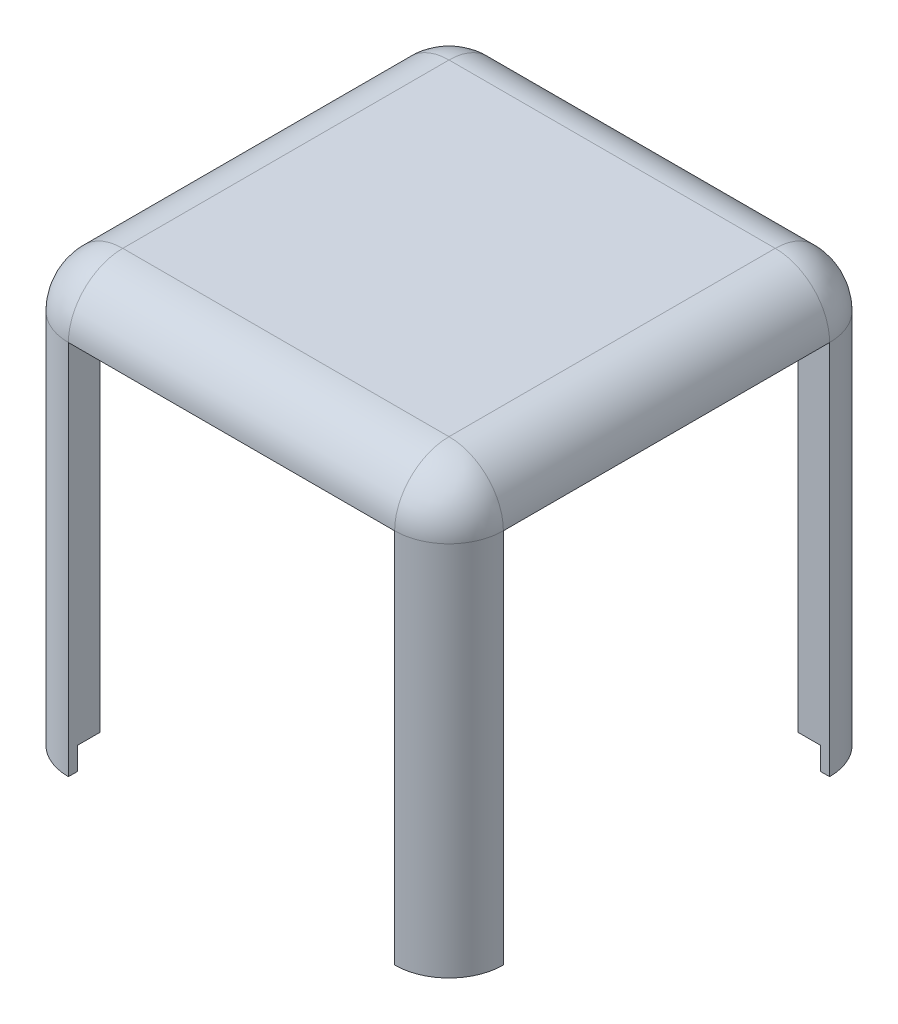
ISO-10303-21;
HEADER;
FILE_DESCRIPTION(('STEP AP214'),'2;1');
FILE_NAME('part.step','',(''),(''),'','','');
FILE_SCHEMA(('AUTOMOTIVE_DESIGN { 1 0 10303 214 1 1 1 1 }'));
ENDSEC;
DATA;
#1=APPLICATION_CONTEXT('core data for automotive mechanical design processes');
#2=APPLICATION_PROTOCOL_DEFINITION('international standard','automotive_design',2000,#1);
#3=PRODUCT_CONTEXT('',#1,'mechanical');
#4=PRODUCT('Part','Part','',(#3));
#5=PRODUCT_RELATED_PRODUCT_CATEGORY('part','',(#4));
#6=PRODUCT_DEFINITION_FORMATION('','',#4);
#7=PRODUCT_DEFINITION_CONTEXT('part definition',#1,'design');
#8=PRODUCT_DEFINITION('design','',#6,#7);
#9=PRODUCT_DEFINITION_SHAPE('','',#8);
#10=(LENGTH_UNIT() NAMED_UNIT(*) SI_UNIT(.MILLI.,.METRE.));
#11=(NAMED_UNIT(*) PLANE_ANGLE_UNIT() SI_UNIT($,.RADIAN.));
#12=(NAMED_UNIT(*) SI_UNIT($,.STERADIAN.) SOLID_ANGLE_UNIT());
#13=UNCERTAINTY_MEASURE_WITH_UNIT(LENGTH_MEASURE(1.E-05),#10,'distance_accuracy_value','');
#14=(GEOMETRIC_REPRESENTATION_CONTEXT(3) GLOBAL_UNCERTAINTY_ASSIGNED_CONTEXT((#13)) GLOBAL_UNIT_ASSIGNED_CONTEXT((#10,
#11,#12)) REPRESENTATION_CONTEXT('',''));
#15=CARTESIAN_POINT('',(0.,0.,0.));
#16=DIRECTION('',(0.,0.,1.));
#17=DIRECTION('',(1.,0.,0.));
#18=AXIS2_PLACEMENT_3D('',#15,#16,#17);
#19=CARTESIAN_POINT('',(-18.,51.5,-18.));
#20=DIRECTION('',(0.,-1.,0.));
#21=DIRECTION('',(0.,0.,-1.));
#22=AXIS2_PLACEMENT_3D('',#19,#20,#21);
#23=CYLINDRICAL_SURFACE('',#22,6.);
#24=DIRECTION('',(0.,-1.,0.));
#25=VECTOR('',#24,1.);
#26=CARTESIAN_POINT('',(-18.,51.5,-24.));
#27=LINE('',#26,#25);
#28=CARTESIAN_POINT('',(-18.,45.5,-24.));
#29=VERTEX_POINT('',#28);
#30=CARTESIAN_POINT('',(-18.,4.,-24.));
#31=VERTEX_POINT('',#30);
#32=EDGE_CURVE('E298',#29,#31,#27,.T.);
#33=ORIENTED_EDGE('',*,*,#32,.T.);
#34=CARTESIAN_POINT('',(-18.,4.,-18.));
#35=DIRECTION('',(0.,-1.,0.));
#36=DIRECTION('',(0.,0.,-1.));
#37=AXIS2_PLACEMENT_3D('',#34,#35,#36);
#38=CIRCLE('',#37,6.);
#39=CARTESIAN_POINT('',(-24.,4.,-18.));
#40=VERTEX_POINT('',#39);
#41=EDGE_CURVE('E547',#40,#31,#38,.T.);
#42=ORIENTED_EDGE('',*,*,#41,.F.);
#43=DIRECTION('',(0.,-1.,0.));
#44=VECTOR('',#43,1.);
#45=CARTESIAN_POINT('',(-24.,51.5,-18.));
#46=LINE('',#45,#44);
#47=CARTESIAN_POINT('',(-24.,45.5,-18.));
#48=VERTEX_POINT('',#47);
#49=EDGE_CURVE('E369',#48,#40,#46,.T.);
#50=ORIENTED_EDGE('',*,*,#49,.F.);
#51=CARTESIAN_POINT('',(-18.,45.5,-18.));
#52=DIRECTION('',(0.,-1.,0.));
#53=DIRECTION('',(0.,0.,-1.));
#54=AXIS2_PLACEMENT_3D('',#51,#52,#53);
#55=CIRCLE('',#54,6.);
#56=EDGE_CURVE('E293',#48,#29,#55,.T.);
#57=ORIENTED_EDGE('',*,*,#56,.T.);
#58=EDGE_LOOP('',(#33,#42,#50,#57));
#59=FACE_BOUND('',#58,.T.);
#60=ADVANCED_FACE('F38',(#59),#23,.T.);
#61=CARTESIAN_POINT('',(-18.,51.5,18.));
#62=DIRECTION('',(0.,-1.,0.));
#63=DIRECTION('',(0.,0.,-1.));
#64=AXIS2_PLACEMENT_3D('',#61,#62,#63);
#65=CYLINDRICAL_SURFACE('',#64,6.);
#66=DIRECTION('',(0.,-1.,0.));
#67=VECTOR('',#66,1.);
#68=CARTESIAN_POINT('',(-24.,51.5,18.));
#69=LINE('',#68,#67);
#70=CARTESIAN_POINT('',(-24.,45.5,18.));
#71=VERTEX_POINT('',#70);
#72=CARTESIAN_POINT('',(-24.,4.,18.));
#73=VERTEX_POINT('',#72);
#74=EDGE_CURVE('E391',#71,#73,#69,.T.);
#75=ORIENTED_EDGE('',*,*,#74,.T.);
#76=CARTESIAN_POINT('',(-18.,4.,18.));
#77=DIRECTION('',(0.,-1.,0.));
#78=DIRECTION('',(0.,0.,-1.));
#79=AXIS2_PLACEMENT_3D('',#76,#77,#78);
#80=CIRCLE('',#79,6.);
#81=CARTESIAN_POINT('',(-18.,4.,24.));
#82=VERTEX_POINT('',#81);
#83=EDGE_CURVE('E558',#82,#73,#80,.T.);
#84=ORIENTED_EDGE('',*,*,#83,.F.);
#85=DIRECTION('',(0.,-1.,0.));
#86=VECTOR('',#85,1.);
#87=CARTESIAN_POINT('',(-18.,51.5,24.));
#88=LINE('',#87,#86);
#89=CARTESIAN_POINT('',(-18.,45.5,24.));
#90=VERTEX_POINT('',#89);
#91=EDGE_CURVE('E387',#90,#82,#88,.T.);
#92=ORIENTED_EDGE('',*,*,#91,.F.);
#93=CARTESIAN_POINT('',(-18.,45.5,18.));
#94=DIRECTION('',(0.,-1.,0.));
#95=DIRECTION('',(0.,0.,-1.));
#96=AXIS2_PLACEMENT_3D('',#93,#94,#95);
#97=CIRCLE('',#96,6.);
#98=EDGE_CURVE('E334',#90,#71,#97,.T.);
#99=ORIENTED_EDGE('',*,*,#98,.T.);
#100=EDGE_LOOP('',(#75,#84,#92,#99));
#101=FACE_BOUND('',#100,.T.);
#102=ADVANCED_FACE('F633',(#101),#65,.T.);
#103=CARTESIAN_POINT('',(18.,51.5,18.));
#104=DIRECTION('',(0.,-1.,0.));
#105=DIRECTION('',(0.,0.,-1.));
#106=AXIS2_PLACEMENT_3D('',#103,#104,#105);
#107=CYLINDRICAL_SURFACE('',#106,6.);
#108=DIRECTION('',(0.,-1.,0.));
#109=VECTOR('',#108,1.);
#110=CARTESIAN_POINT('',(18.,51.5,24.));
#111=LINE('',#110,#109);
#112=CARTESIAN_POINT('',(18.,45.5,24.));
#113=VERTEX_POINT('',#112);
#114=CARTESIAN_POINT('',(18.,4.,24.));
#115=VERTEX_POINT('',#114);
#116=EDGE_CURVE('E383',#113,#115,#111,.T.);
#117=ORIENTED_EDGE('',*,*,#116,.T.);
#118=CARTESIAN_POINT('',(18.,4.,18.));
#119=DIRECTION('',(0.,-1.,0.));
#120=DIRECTION('',(0.,0.,-1.));
#121=AXIS2_PLACEMENT_3D('',#118,#119,#120);
#122=CIRCLE('',#121,6.);
#123=CARTESIAN_POINT('',(24.,4.,18.));
#124=VERTEX_POINT('',#123);
#125=EDGE_CURVE('E253',#124,#115,#122,.T.);
#126=ORIENTED_EDGE('',*,*,#125,.F.);
#127=DIRECTION('',(0.,-1.,0.));
#128=VECTOR('',#127,1.);
#129=CARTESIAN_POINT('',(24.,51.5,18.));
#130=LINE('',#129,#128);
#131=CARTESIAN_POINT('',(24.,45.5,18.));
#132=VERTEX_POINT('',#131);
#133=EDGE_CURVE('E251',#132,#124,#130,.T.);
#134=ORIENTED_EDGE('',*,*,#133,.F.);
#135=CARTESIAN_POINT('',(18.,45.5,18.));
#136=DIRECTION('',(0.,-1.,0.));
#137=DIRECTION('',(0.,0.,-1.));
#138=AXIS2_PLACEMENT_3D('',#135,#136,#137);
#139=CIRCLE('',#138,6.);
#140=EDGE_CURVE('E341',#132,#113,#139,.T.);
#141=ORIENTED_EDGE('',*,*,#140,.T.);
#142=EDGE_LOOP('',(#117,#126,#134,#141));
#143=FACE_BOUND('',#142,.T.);
#144=ADVANCED_FACE('F575',(#143),#107,.T.);
#145=CARTESIAN_POINT('',(18.,51.5,-18.));
#146=DIRECTION('',(0.,-1.,0.));
#147=DIRECTION('',(0.,0.,-1.));
#148=AXIS2_PLACEMENT_3D('',#145,#146,#147);
#149=CYLINDRICAL_SURFACE('',#148,6.);
#150=DIRECTION('',(0.,-1.,0.));
#151=VECTOR('',#150,1.);
#152=CARTESIAN_POINT('',(24.,51.5,-18.));
#153=LINE('',#152,#151);
#154=CARTESIAN_POINT('',(24.,45.5,-18.));
#155=VERTEX_POINT('',#154);
#156=CARTESIAN_POINT('',(24.,4.,-18.));
#157=VERTEX_POINT('',#156);
#158=EDGE_CURVE('E377',#155,#157,#153,.T.);
#159=ORIENTED_EDGE('',*,*,#158,.T.);
#160=CARTESIAN_POINT('',(18.,4.,-18.));
#161=DIRECTION('',(0.,-1.,0.));
#162=DIRECTION('',(0.,0.,-1.));
#163=AXIS2_PLACEMENT_3D('',#160,#161,#162);
#164=CIRCLE('',#163,6.);
#165=CARTESIAN_POINT('',(18.,4.,-24.));
#166=VERTEX_POINT('',#165);
#167=EDGE_CURVE('E534',#166,#157,#164,.T.);
#168=ORIENTED_EDGE('',*,*,#167,.F.);
#169=DIRECTION('',(0.,-1.,0.));
#170=VECTOR('',#169,1.);
#171=CARTESIAN_POINT('',(18.,51.5,-24.));
#172=LINE('',#171,#170);
#173=CARTESIAN_POINT('',(18.,45.5,-24.));
#174=VERTEX_POINT('',#173);
#175=EDGE_CURVE('E373',#174,#166,#172,.T.);
#176=ORIENTED_EDGE('',*,*,#175,.F.);
#177=CARTESIAN_POINT('',(18.,45.5,-18.));
#178=DIRECTION('',(0.,-1.,0.));
#179=DIRECTION('',(0.,0.,-1.));
#180=AXIS2_PLACEMENT_3D('',#177,#178,#179);
#181=CIRCLE('',#180,6.);
#182=EDGE_CURVE('E348',#174,#155,#181,.T.);
#183=ORIENTED_EDGE('',*,*,#182,.T.);
#184=EDGE_LOOP('',(#159,#168,#176,#183));
#185=FACE_BOUND('',#184,.T.);
#186=ADVANCED_FACE('F689',(#185),#149,.T.);
#187=CARTESIAN_POINT('',(-18.,0.,30.));
#188=DIRECTION('',(-1.,0.,0.));
#189=DIRECTION('',(0.,0.,1.));
#190=AXIS2_PLACEMENT_3D('',#187,#188,#189);
#191=PLANE('',#190);
#192=DIRECTION('',(0.,0.,1.));
#193=VECTOR('',#192,1.);
#194=CARTESIAN_POINT('',(-18.,4.,22.9772255750517));
#195=LINE('',#194,#193);
#196=CARTESIAN_POINT('',(-18.,4.,22.9772255750517));
#197=VERTEX_POINT('',#196);
#198=EDGE_CURVE('E561',#197,#82,#195,.T.);
#199=ORIENTED_EDGE('',*,*,#198,.F.);
#200=DIRECTION('',(0.,-1.,0.));
#201=VECTOR('',#200,1.);
#202=CARTESIAN_POINT('',(-18.,6.5,22.9772255750517));
#203=LINE('',#202,#201);
#204=CARTESIAN_POINT('',(-18.,6.5,22.9772255750517));
#205=VERTEX_POINT('',#204);
#206=EDGE_CURVE('E471',#197,#205,#203,.F.);
#207=ORIENTED_EDGE('',*,*,#206,.T.);
#208=DIRECTION('',(0.,0.,1.));
#209=VECTOR('',#208,1.);
#210=CARTESIAN_POINT('',(-18.,6.5,30.));
#211=LINE('',#210,#209);
#212=CARTESIAN_POINT('',(-18.,6.5,20.5));
#213=VERTEX_POINT('',#212);
#214=EDGE_CURVE('E489',#213,#205,#211,.T.);
#215=ORIENTED_EDGE('',*,*,#214,.F.);
#216=DIRECTION('',(0.,-1.,0.));
#217=VECTOR('',#216,1.);
#218=CARTESIAN_POINT('',(-18.,48.5,20.5));
#219=LINE('',#218,#217);
#220=CARTESIAN_POINT('',(-18.,45.5,20.5));
#221=VERTEX_POINT('',#220);
#222=EDGE_CURVE('E282',#221,#213,#219,.T.);
#223=ORIENTED_EDGE('',*,*,#222,.F.);
#224=DIRECTION('',(0.,0.,-1.));
#225=VECTOR('',#224,1.);
#226=CARTESIAN_POINT('',(-18.,45.5,30.));
#227=LINE('',#226,#225);
#228=EDGE_CURVE('E440',#90,#221,#227,.T.);
#229=ORIENTED_EDGE('',*,*,#228,.F.);
#230=ORIENTED_EDGE('',*,*,#91,.T.);
#231=EDGE_LOOP('',(#199,#207,#215,#223,#229,#230));
#232=FACE_BOUND('',#231,.T.);
#233=ADVANCED_FACE('F636',(#232),#191,.F.);
#234=CARTESIAN_POINT('',(18.,45.5,30.));
#235=DIRECTION('',(1.,0.,0.));
#236=DIRECTION('',(0.,0.,-1.));
#237=AXIS2_PLACEMENT_3D('',#234,#235,#236);
#238=PLANE('',#237);
#239=DIRECTION('',(0.,0.,-1.));
#240=VECTOR('',#239,1.);
#241=CARTESIAN_POINT('',(18.,4.,24.));
#242=LINE('',#241,#240);
#243=CARTESIAN_POINT('',(18.,4.,22.9772255750517));
#244=VERTEX_POINT('',#243);
#245=EDGE_CURVE('E62',#115,#244,#242,.T.);
#246=ORIENTED_EDGE('',*,*,#245,.F.);
#247=ORIENTED_EDGE('',*,*,#116,.F.);
#248=DIRECTION('',(0.,0.,-1.));
#249=VECTOR('',#248,1.);
#250=CARTESIAN_POINT('',(18.,45.5,30.));
#251=LINE('',#250,#249);
#252=CARTESIAN_POINT('',(18.,45.5,20.5));
#253=VERTEX_POINT('',#252);
#254=EDGE_CURVE('E444',#113,#253,#251,.T.);
#255=ORIENTED_EDGE('',*,*,#254,.T.);
#256=DIRECTION('',(0.,1.,0.));
#257=VECTOR('',#256,1.);
#258=CARTESIAN_POINT('',(18.,48.5,20.5));
#259=LINE('',#258,#257);
#260=CARTESIAN_POINT('',(18.,6.5,20.5));
#261=VERTEX_POINT('',#260);
#262=EDGE_CURVE('E290',#261,#253,#259,.T.);
#263=ORIENTED_EDGE('',*,*,#262,.F.);
#264=DIRECTION('',(0.,0.,-1.));
#265=VECTOR('',#264,1.);
#266=CARTESIAN_POINT('',(18.,6.5,30.));
#267=LINE('',#266,#265);
#268=CARTESIAN_POINT('',(18.,6.5,22.9772255750517));
#269=VERTEX_POINT('',#268);
#270=EDGE_CURVE('E500',#269,#261,#267,.T.);
#271=ORIENTED_EDGE('',*,*,#270,.F.);
#272=DIRECTION('',(0.,-1.,0.));
#273=VECTOR('',#272,1.);
#274=CARTESIAN_POINT('',(18.,6.5,22.9772255750517));
#275=LINE('',#274,#273);
#276=EDGE_CURVE('E474',#269,#244,#275,.T.);
#277=ORIENTED_EDGE('',*,*,#276,.T.);
#278=EDGE_LOOP('',(#246,#247,#255,#263,#271,#277));
#279=FACE_BOUND('',#278,.T.);
#280=ADVANCED_FACE('F571',(#279),#238,.F.);
#281=DIRECTION('',(0.,0.,1.));
#282=VECTOR('',#281,1.);
#283=CARTESIAN_POINT('',(-18.,4.,-24.));
#284=LINE('',#283,#282);
#285=CARTESIAN_POINT('',(-18.,4.,-22.9772255750517));
#286=VERTEX_POINT('',#285);
#287=EDGE_CURVE('E543',#31,#286,#284,.T.);
#288=ORIENTED_EDGE('',*,*,#287,.F.);
#289=ORIENTED_EDGE('',*,*,#32,.F.);
#290=CARTESIAN_POINT('',(-18.,45.5,-20.5));
#291=VERTEX_POINT('',#290);
#292=EDGE_CURVE('E446',#291,#29,#227,.T.);
#293=ORIENTED_EDGE('',*,*,#292,.F.);
#294=DIRECTION('',(0.,1.,0.));
#295=VECTOR('',#294,1.);
#296=CARTESIAN_POINT('',(-18.,48.5,-20.5));
#297=LINE('',#296,#295);
#298=CARTESIAN_POINT('',(-18.,6.5,-20.5));
#299=VERTEX_POINT('',#298);
#300=EDGE_CURVE('E433',#299,#291,#297,.T.);
#301=ORIENTED_EDGE('',*,*,#300,.F.);
#302=DIRECTION('',(0.,0.,1.));
#303=VECTOR('',#302,1.);
#304=CARTESIAN_POINT('',(-18.,6.5,30.));
#305=LINE('',#304,#303);
#306=CARTESIAN_POINT('',(-18.,6.5,-22.9772255750517));
#307=VERTEX_POINT('',#306);
#308=EDGE_CURVE('E480',#307,#299,#305,.T.);
#309=ORIENTED_EDGE('',*,*,#308,.F.);
#310=DIRECTION('',(0.,-1.,0.));
#311=VECTOR('',#310,1.);
#312=CARTESIAN_POINT('',(-18.,6.5,-22.9772255750517));
#313=LINE('',#312,#311);
#314=EDGE_CURVE('E464',#307,#286,#313,.T.);
#315=ORIENTED_EDGE('',*,*,#314,.T.);
#316=EDGE_LOOP('',(#288,#289,#293,#301,#309,#315));
#317=FACE_BOUND('',#316,.T.);
#318=ADVANCED_FACE('F729',(#317),#191,.F.);
#319=DIRECTION('',(0.,0.,-1.));
#320=VECTOR('',#319,1.);
#321=CARTESIAN_POINT('',(18.,4.,-22.9772255750517));
#322=LINE('',#321,#320);
#323=CARTESIAN_POINT('',(18.,4.,-22.9772255750517));
#324=VERTEX_POINT('',#323);
#325=EDGE_CURVE('E537',#324,#166,#322,.T.);
#326=ORIENTED_EDGE('',*,*,#325,.F.);
#327=DIRECTION('',(0.,-1.,0.));
#328=VECTOR('',#327,1.);
#329=CARTESIAN_POINT('',(18.,6.5,-22.9772255750517));
#330=LINE('',#329,#328);
#331=CARTESIAN_POINT('',(18.,6.5,-22.9772255750517));
#332=VERTEX_POINT('',#331);
#333=EDGE_CURVE('E477',#324,#332,#330,.F.);
#334=ORIENTED_EDGE('',*,*,#333,.T.);
#335=DIRECTION('',(0.,0.,-1.));
#336=VECTOR('',#335,1.);
#337=CARTESIAN_POINT('',(18.,6.5,30.));
#338=LINE('',#337,#336);
#339=CARTESIAN_POINT('',(18.,6.5,-20.5));
#340=VERTEX_POINT('',#339);
#341=EDGE_CURVE('E510',#340,#332,#338,.T.);
#342=ORIENTED_EDGE('',*,*,#341,.F.);
#343=DIRECTION('',(0.,-1.,0.));
#344=VECTOR('',#343,1.);
#345=CARTESIAN_POINT('',(18.,48.5,-20.5));
#346=LINE('',#345,#344);
#347=CARTESIAN_POINT('',(18.,45.5,-20.5));
#348=VERTEX_POINT('',#347);
#349=EDGE_CURVE('E436',#348,#340,#346,.T.);
#350=ORIENTED_EDGE('',*,*,#349,.F.);
#351=EDGE_CURVE('E441',#348,#174,#251,.T.);
#352=ORIENTED_EDGE('',*,*,#351,.T.);
#353=ORIENTED_EDGE('',*,*,#175,.T.);
#354=EDGE_LOOP('',(#326,#334,#342,#350,#352,#353));
#355=FACE_BOUND('',#354,.T.);
#356=ADVANCED_FACE('F742',(#355),#238,.F.);
#357=CARTESIAN_POINT('',(30.,45.5,-18.));
#358=DIRECTION('',(0.,0.,-1.));
#359=DIRECTION('',(-1.,0.,0.));
#360=AXIS2_PLACEMENT_3D('',#357,#358,#359);
#361=PLANE('',#360);
#362=DIRECTION('',(-1.,0.,0.));
#363=VECTOR('',#362,1.);
#364=CARTESIAN_POINT('',(-22.9772255750517,4.,-18.));
#365=LINE('',#364,#363);
#366=CARTESIAN_POINT('',(-22.9772255750517,4.,-18.));
#367=VERTEX_POINT('',#366);
#368=EDGE_CURVE('E550',#367,#40,#365,.T.);
#369=ORIENTED_EDGE('',*,*,#368,.F.);
#370=DIRECTION('',(0.,-1.,0.));
#371=VECTOR('',#370,1.);
#372=CARTESIAN_POINT('',(-22.9772255750517,6.5,-18.));
#373=LINE('',#372,#371);
#374=CARTESIAN_POINT('',(-22.9772255750517,6.5,-18.));
#375=VERTEX_POINT('',#374);
#376=EDGE_CURVE('E11',#367,#375,#373,.F.);
#377=ORIENTED_EDGE('',*,*,#376,.T.);
#378=DIRECTION('',(-1.,0.,0.));
#379=VECTOR('',#378,1.);
#380=CARTESIAN_POINT('',(30.,6.5,-18.));
#381=LINE('',#380,#379);
#382=CARTESIAN_POINT('',(-20.5,6.5,-18.));
#383=VERTEX_POINT('',#382);
#384=EDGE_CURVE('E484',#383,#375,#381,.T.);
#385=ORIENTED_EDGE('',*,*,#384,.F.);
#386=DIRECTION('',(0.,-1.,0.));
#387=VECTOR('',#386,1.);
#388=CARTESIAN_POINT('',(-20.5,48.5,-18.));
#389=LINE('',#388,#387);
#390=CARTESIAN_POINT('',(-20.5,45.5,-18.));
#391=VERTEX_POINT('',#390);
#392=EDGE_CURVE('E278',#391,#383,#389,.T.);
#393=ORIENTED_EDGE('',*,*,#392,.F.);
#394=DIRECTION('',(-1.,0.,0.));
#395=VECTOR('',#394,1.);
#396=CARTESIAN_POINT('',(30.,45.5,-18.));
#397=LINE('',#396,#395);
#398=EDGE_CURVE('E460',#391,#48,#397,.T.);
#399=ORIENTED_EDGE('',*,*,#398,.T.);
#400=ORIENTED_EDGE('',*,*,#49,.T.);
#401=EDGE_LOOP('',(#369,#377,#385,#393,#399,#400));
#402=FACE_BOUND('',#401,.T.);
#403=ADVANCED_FACE('F618',(#402),#361,.F.);
#404=CARTESIAN_POINT('',(30.,0.,18.));
#405=DIRECTION('',(0.,0.,1.));
#406=DIRECTION('',(1.,0.,0.));
#407=AXIS2_PLACEMENT_3D('',#404,#405,#406);
#408=PLANE('',#407);
#409=DIRECTION('',(1.,0.,0.));
#410=VECTOR('',#409,1.);
#411=CARTESIAN_POINT('',(-24.,4.,18.));
#412=LINE('',#411,#410);
#413=CARTESIAN_POINT('',(-22.9772255750517,4.,18.));
#414=VERTEX_POINT('',#413);
#415=EDGE_CURVE('E241',#73,#414,#412,.T.);
#416=ORIENTED_EDGE('',*,*,#415,.F.);
#417=ORIENTED_EDGE('',*,*,#74,.F.);
#418=DIRECTION('',(-1.,0.,0.));
#419=VECTOR('',#418,1.);
#420=CARTESIAN_POINT('',(30.,45.5,18.));
#421=LINE('',#420,#419);
#422=CARTESIAN_POINT('',(-20.5,45.5,18.));
#423=VERTEX_POINT('',#422);
#424=EDGE_CURVE('E465',#423,#71,#421,.T.);
#425=ORIENTED_EDGE('',*,*,#424,.F.);
#426=DIRECTION('',(0.,1.,0.));
#427=VECTOR('',#426,1.);
#428=CARTESIAN_POINT('',(-20.5,48.5,18.));
#429=LINE('',#428,#427);
#430=CARTESIAN_POINT('',(-20.5,6.5,18.));
#431=VERTEX_POINT('',#430);
#432=EDGE_CURVE('E271',#431,#423,#429,.T.);
#433=ORIENTED_EDGE('',*,*,#432,.F.);
#434=DIRECTION('',(1.,0.,0.));
#435=VECTOR('',#434,1.);
#436=CARTESIAN_POINT('',(30.,6.5,18.));
#437=LINE('',#436,#435);
#438=CARTESIAN_POINT('',(-22.9772255750517,6.5,18.));
#439=VERTEX_POINT('',#438);
#440=EDGE_CURVE('E497',#439,#431,#437,.T.);
#441=ORIENTED_EDGE('',*,*,#440,.F.);
#442=DIRECTION('',(0.,-1.,0.));
#443=VECTOR('',#442,1.);
#444=CARTESIAN_POINT('',(-22.9772255750517,6.5,18.));
#445=LINE('',#444,#443);
#446=EDGE_CURVE('E47',#439,#414,#445,.T.);
#447=ORIENTED_EDGE('',*,*,#446,.T.);
#448=EDGE_LOOP('',(#416,#417,#425,#433,#441,#447));
#449=FACE_BOUND('',#448,.T.);
#450=ADVANCED_FACE('F628',(#449),#408,.F.);
#451=DIRECTION('',(1.,0.,0.));
#452=VECTOR('',#451,1.);
#453=CARTESIAN_POINT('',(22.9772255750517,4.,18.));
#454=LINE('',#453,#452);
#455=CARTESIAN_POINT('',(22.9772255750517,4.,18.));
#456=VERTEX_POINT('',#455);
#457=EDGE_CURVE('E235',#456,#124,#454,.T.);
#458=ORIENTED_EDGE('',*,*,#457,.F.);
#459=DIRECTION('',(0.,-1.,0.));
#460=VECTOR('',#459,1.);
#461=CARTESIAN_POINT('',(22.9772255750517,6.5,18.));
#462=LINE('',#461,#460);
#463=CARTESIAN_POINT('',(22.9772255750517,6.5,18.));
#464=VERTEX_POINT('',#463);
#465=EDGE_CURVE('E247',#456,#464,#462,.F.);
#466=ORIENTED_EDGE('',*,*,#465,.T.);
#467=DIRECTION('',(1.,0.,0.));
#468=VECTOR('',#467,1.);
#469=CARTESIAN_POINT('',(30.,6.5,18.));
#470=LINE('',#469,#468);
#471=CARTESIAN_POINT('',(20.5,6.5,18.));
#472=VERTEX_POINT('',#471);
#473=EDGE_CURVE('E507',#472,#464,#470,.T.);
#474=ORIENTED_EDGE('',*,*,#473,.F.);
#475=DIRECTION('',(0.,-1.,0.));
#476=VECTOR('',#475,1.);
#477=CARTESIAN_POINT('',(20.5,48.5,18.));
#478=LINE('',#477,#476);
#479=CARTESIAN_POINT('',(20.5,45.5,18.));
#480=VERTEX_POINT('',#479);
#481=EDGE_CURVE('E452',#480,#472,#478,.T.);
#482=ORIENTED_EDGE('',*,*,#481,.F.);
#483=EDGE_CURVE('E459',#132,#480,#421,.T.);
#484=ORIENTED_EDGE('',*,*,#483,.F.);
#485=ORIENTED_EDGE('',*,*,#133,.T.);
#486=EDGE_LOOP('',(#458,#466,#474,#482,#484,#485));
#487=FACE_BOUND('',#486,.T.);
#488=ADVANCED_FACE('F245',(#487),#408,.F.);
#489=DIRECTION('',(-1.,0.,0.));
#490=VECTOR('',#489,1.);
#491=CARTESIAN_POINT('',(24.,4.,-18.));
#492=LINE('',#491,#490);
#493=CARTESIAN_POINT('',(22.9772255750517,4.,-18.));
#494=VERTEX_POINT('',#493);
#495=EDGE_CURVE('E54',#157,#494,#492,.T.);
#496=ORIENTED_EDGE('',*,*,#495,.F.);
#497=ORIENTED_EDGE('',*,*,#158,.F.);
#498=CARTESIAN_POINT('',(20.5,45.5,-18.));
#499=VERTEX_POINT('',#498);
#500=EDGE_CURVE('E463',#155,#499,#397,.T.);
#501=ORIENTED_EDGE('',*,*,#500,.T.);
#502=DIRECTION('',(0.,1.,0.));
#503=VECTOR('',#502,1.);
#504=CARTESIAN_POINT('',(20.5,48.5,-18.));
#505=LINE('',#504,#503);
#506=CARTESIAN_POINT('',(20.5,6.5,-18.));
#507=VERTEX_POINT('',#506);
#508=EDGE_CURVE('E456',#507,#499,#505,.T.);
#509=ORIENTED_EDGE('',*,*,#508,.F.);
#510=DIRECTION('',(-1.,0.,0.));
#511=VECTOR('',#510,1.);
#512=CARTESIAN_POINT('',(30.,6.5,-18.));
#513=LINE('',#512,#511);
#514=CARTESIAN_POINT('',(22.9772255750517,6.5,-18.));
#515=VERTEX_POINT('',#514);
#516=EDGE_CURVE('E266',#515,#507,#513,.T.);
#517=ORIENTED_EDGE('',*,*,#516,.F.);
#518=DIRECTION('',(0.,-1.,0.));
#519=VECTOR('',#518,1.);
#520=CARTESIAN_POINT('',(22.9772255750517,6.5,-18.));
#521=LINE('',#520,#519);
#522=EDGE_CURVE('E260',#515,#494,#521,.T.);
#523=ORIENTED_EDGE('',*,*,#522,.T.);
#524=EDGE_LOOP('',(#496,#497,#501,#509,#517,#523));
#525=FACE_BOUND('',#524,.T.);
#526=ADVANCED_FACE('F732',(#525),#361,.F.);
#527=CARTESIAN_POINT('',(17.5,6.5,-17.5));
#528=DIRECTION('',(0.,-1.,0.));
#529=DIRECTION('',(0.,0.,-1.));
#530=AXIS2_PLACEMENT_3D('',#527,#528,#529);
#531=CYLINDRICAL_SURFACE('',#530,5.5);
#532=CARTESIAN_POINT('',(17.5,4.,-17.5));
#533=DIRECTION('',(0.,1.,0.));
#534=DIRECTION('',(0.,0.,-1.));
#535=AXIS2_PLACEMENT_3D('',#532,#533,#534);
#536=CIRCLE('',#535,5.5);
#537=EDGE_CURVE('E540',#494,#324,#536,.T.);
#538=ORIENTED_EDGE('',*,*,#537,.F.);
#539=ORIENTED_EDGE('',*,*,#522,.F.);
#540=CARTESIAN_POINT('',(17.5,6.5,-17.5));
#541=DIRECTION('',(0.,-1.,0.));
#542=DIRECTION('',(0.,0.,-1.));
#543=AXIS2_PLACEMENT_3D('',#540,#541,#542);
#544=CIRCLE('',#543,5.5);
#545=EDGE_CURVE('E525',#332,#515,#544,.T.);
#546=ORIENTED_EDGE('',*,*,#545,.F.);
#547=ORIENTED_EDGE('',*,*,#333,.F.);
#548=EDGE_LOOP('',(#538,#539,#546,#547));
#549=FACE_BOUND('',#548,.T.);
#550=ADVANCED_FACE('F737',(#549),#531,.F.);
#551=CARTESIAN_POINT('',(17.5,6.5,17.5));
#552=DIRECTION('',(0.,-1.,0.));
#553=DIRECTION('',(0.,0.,-1.));
#554=AXIS2_PLACEMENT_3D('',#551,#552,#553);
#555=CYLINDRICAL_SURFACE('',#554,5.5);
#556=CARTESIAN_POINT('',(17.5,4.,17.5));
#557=DIRECTION('',(0.,1.,0.));
#558=DIRECTION('',(0.,0.,-1.));
#559=AXIS2_PLACEMENT_3D('',#556,#557,#558);
#560=CIRCLE('',#559,5.5);
#561=EDGE_CURVE('E232',#244,#456,#560,.T.);
#562=ORIENTED_EDGE('',*,*,#561,.F.);
#563=ORIENTED_EDGE('',*,*,#276,.F.);
#564=CARTESIAN_POINT('',(17.5,6.5,17.5));
#565=DIRECTION('',(0.,-1.,0.));
#566=DIRECTION('',(0.,0.,-1.));
#567=AXIS2_PLACEMENT_3D('',#564,#565,#566);
#568=CIRCLE('',#567,5.5);
#569=EDGE_CURVE('E258',#464,#269,#568,.T.);
#570=ORIENTED_EDGE('',*,*,#569,.F.);
#571=ORIENTED_EDGE('',*,*,#465,.F.);
#572=EDGE_LOOP('',(#562,#563,#570,#571));
#573=FACE_BOUND('',#572,.T.);
#574=ADVANCED_FACE('F256',(#573),#555,.F.);
#575=CARTESIAN_POINT('',(-17.5,6.5,17.5));
#576=DIRECTION('',(0.,-1.,0.));
#577=DIRECTION('',(0.,0.,-1.));
#578=AXIS2_PLACEMENT_3D('',#575,#576,#577);
#579=CYLINDRICAL_SURFACE('',#578,5.5);
#580=CARTESIAN_POINT('',(-17.5,4.,17.5));
#581=DIRECTION('',(0.,1.,0.));
#582=DIRECTION('',(0.,0.,-1.));
#583=AXIS2_PLACEMENT_3D('',#580,#581,#582);
#584=CIRCLE('',#583,5.5);
#585=EDGE_CURVE('E546',#414,#197,#584,.T.);
#586=ORIENTED_EDGE('',*,*,#585,.F.);
#587=ORIENTED_EDGE('',*,*,#446,.F.);
#588=CARTESIAN_POINT('',(-17.5,6.5,17.5));
#589=DIRECTION('',(0.,-1.,0.));
#590=DIRECTION('',(0.,0.,-1.));
#591=AXIS2_PLACEMENT_3D('',#588,#589,#590);
#592=CIRCLE('',#591,5.5);
#593=EDGE_CURVE('E520',#205,#439,#592,.T.);
#594=ORIENTED_EDGE('',*,*,#593,.F.);
#595=ORIENTED_EDGE('',*,*,#206,.F.);
#596=EDGE_LOOP('',(#586,#587,#594,#595));
#597=FACE_BOUND('',#596,.T.);
#598=ADVANCED_FACE('F773',(#597),#579,.F.);
#599=CARTESIAN_POINT('',(-17.5,6.5,-17.5));
#600=DIRECTION('',(0.,-1.,0.));
#601=DIRECTION('',(0.,0.,-1.));
#602=AXIS2_PLACEMENT_3D('',#599,#600,#601);
#603=CYLINDRICAL_SURFACE('',#602,5.5);
#604=CARTESIAN_POINT('',(-17.5,4.,-17.5));
#605=DIRECTION('',(0.,1.,0.));
#606=DIRECTION('',(0.,0.,-1.));
#607=AXIS2_PLACEMENT_3D('',#604,#605,#606);
#608=CIRCLE('',#607,5.5);
#609=EDGE_CURVE('E553',#286,#367,#608,.T.);
#610=ORIENTED_EDGE('',*,*,#609,.F.);
#611=ORIENTED_EDGE('',*,*,#314,.F.);
#612=CARTESIAN_POINT('',(-17.5,6.5,-17.5));
#613=DIRECTION('',(0.,-1.,0.));
#614=DIRECTION('',(0.,0.,-1.));
#615=AXIS2_PLACEMENT_3D('',#612,#613,#614);
#616=CIRCLE('',#615,5.5);
#617=EDGE_CURVE('E528',#375,#307,#616,.T.);
#618=ORIENTED_EDGE('',*,*,#617,.F.);
#619=ORIENTED_EDGE('',*,*,#376,.F.);
#620=EDGE_LOOP('',(#610,#611,#618,#619));
#621=FACE_BOUND('',#620,.T.);
#622=ADVANCED_FACE('F718',(#621),#603,.F.);
#623=CARTESIAN_POINT('',(20.5,48.5,-20.5));
#624=DIRECTION('',(1.,0.,0.));
#625=DIRECTION('',(0.,0.,-1.));
#626=AXIS2_PLACEMENT_3D('',#623,#624,#625);
#627=PLANE('',#626);
#628=DIRECTION('',(0.,0.,-1.));
#629=VECTOR('',#628,1.);
#630=CARTESIAN_POINT('',(20.5,6.5,-20.5));
#631=LINE('',#630,#629);
#632=CARTESIAN_POINT('',(20.5,6.5,20.5));
#633=VERTEX_POINT('',#632);
#634=EDGE_CURVE('E506',#633,#472,#631,.T.);
#635=ORIENTED_EDGE('',*,*,#634,.F.);
#636=DIRECTION('',(0.,-1.,0.));
#637=VECTOR('',#636,1.);
#638=CARTESIAN_POINT('',(20.5,48.5,20.5));
#639=LINE('',#638,#637);
#640=CARTESIAN_POINT('',(20.5,48.5,20.5));
#641=VERTEX_POINT('',#640);
#642=EDGE_CURVE('E398',#641,#633,#639,.T.);
#643=ORIENTED_EDGE('',*,*,#642,.F.);
#644=DIRECTION('',(0.,0.,1.));
#645=VECTOR('',#644,1.);
#646=CARTESIAN_POINT('',(20.5,48.5,-20.5));
#647=LINE('',#646,#645);
#648=CARTESIAN_POINT('',(20.5,48.5,-20.5));
#649=VERTEX_POINT('',#648);
#650=EDGE_CURVE('E425',#649,#641,#647,.T.);
#651=ORIENTED_EDGE('',*,*,#650,.F.);
#652=DIRECTION('',(0.,-1.,0.));
#653=VECTOR('',#652,1.);
#654=CARTESIAN_POINT('',(20.5,48.5,-20.5));
#655=LINE('',#654,#653);
#656=CARTESIAN_POINT('',(20.5,6.5,-20.5));
#657=VERTEX_POINT('',#656);
#658=EDGE_CURVE('E326',#649,#657,#655,.T.);
#659=ORIENTED_EDGE('',*,*,#658,.T.);
#660=EDGE_CURVE('E517',#507,#657,#631,.T.);
#661=ORIENTED_EDGE('',*,*,#660,.F.);
#662=ORIENTED_EDGE('',*,*,#508,.T.);
#663=DIRECTION('',(0.,0.,1.));
#664=VECTOR('',#663,1.);
#665=CARTESIAN_POINT('',(20.5,45.5,-20.5));
#666=LINE('',#665,#664);
#667=EDGE_CURVE('E445',#499,#480,#666,.T.);
#668=ORIENTED_EDGE('',*,*,#667,.T.);
#669=ORIENTED_EDGE('',*,*,#481,.T.);
#670=EDGE_LOOP('',(#635,#643,#651,#659,#661,#662,#668,#669));
#671=FACE_BOUND('',#670,.T.);
#672=ADVANCED_FACE('F655',(#671),#627,.F.);
#673=CARTESIAN_POINT('',(-20.5,48.5,-20.5));
#674=DIRECTION('',(0.,0.,-1.));
#675=DIRECTION('',(-1.,0.,0.));
#676=AXIS2_PLACEMENT_3D('',#673,#674,#675);
#677=PLANE('',#676);
#678=DIRECTION('',(-1.,0.,0.));
#679=VECTOR('',#678,1.);
#680=CARTESIAN_POINT('',(-20.5,6.5,-20.5));
#681=LINE('',#680,#679);
#682=EDGE_CURVE('E514',#657,#340,#681,.T.);
#683=ORIENTED_EDGE('',*,*,#682,.F.);
#684=ORIENTED_EDGE('',*,*,#658,.F.);
#685=DIRECTION('',(1.,0.,0.));
#686=VECTOR('',#685,1.);
#687=CARTESIAN_POINT('',(-20.5,48.5,-20.5));
#688=LINE('',#687,#686);
#689=CARTESIAN_POINT('',(-20.5,48.5,-20.5));
#690=VERTEX_POINT('',#689);
#691=EDGE_CURVE('E403',#690,#649,#688,.T.);
#692=ORIENTED_EDGE('',*,*,#691,.F.);
#693=DIRECTION('',(0.,-1.,0.));
#694=VECTOR('',#693,1.);
#695=CARTESIAN_POINT('',(-20.5,48.5,-20.5));
#696=LINE('',#695,#694);
#697=CARTESIAN_POINT('',(-20.5,6.5,-20.5));
#698=VERTEX_POINT('',#697);
#699=EDGE_CURVE('E407',#690,#698,#696,.T.);
#700=ORIENTED_EDGE('',*,*,#699,.T.);
#701=EDGE_CURVE('E483',#299,#698,#681,.T.);
#702=ORIENTED_EDGE('',*,*,#701,.F.);
#703=ORIENTED_EDGE('',*,*,#300,.T.);
#704=DIRECTION('',(1.,0.,0.));
#705=VECTOR('',#704,1.);
#706=CARTESIAN_POINT('',(-20.5,45.5,-20.5));
#707=LINE('',#706,#705);
#708=EDGE_CURVE('E429',#291,#348,#707,.T.);
#709=ORIENTED_EDGE('',*,*,#708,.T.);
#710=ORIENTED_EDGE('',*,*,#349,.T.);
#711=EDGE_LOOP('',(#683,#684,#692,#700,#702,#703,#709,#710));
#712=FACE_BOUND('',#711,.T.);
#713=ADVANCED_FACE('F706',(#712),#677,.F.);
#714=CARTESIAN_POINT('',(-20.5,48.5,-20.5));
#715=DIRECTION('',(-1.,0.,0.));
#716=DIRECTION('',(0.,0.,1.));
#717=AXIS2_PLACEMENT_3D('',#714,#715,#716);
#718=PLANE('',#717);
#719=DIRECTION('',(0.,0.,1.));
#720=VECTOR('',#719,1.);
#721=CARTESIAN_POINT('',(-20.5,6.5,-20.5));
#722=LINE('',#721,#720);
#723=EDGE_CURVE('E488',#698,#383,#722,.T.);
#724=ORIENTED_EDGE('',*,*,#723,.F.);
#725=ORIENTED_EDGE('',*,*,#699,.F.);
#726=DIRECTION('',(0.,0.,-1.));
#727=VECTOR('',#726,1.);
#728=CARTESIAN_POINT('',(-20.5,48.5,-20.5));
#729=LINE('',#728,#727);
#730=CARTESIAN_POINT('',(-20.5,48.5,20.5));
#731=VERTEX_POINT('',#730);
#732=EDGE_CURVE('E417',#731,#690,#729,.T.);
#733=ORIENTED_EDGE('',*,*,#732,.F.);
#734=DIRECTION('',(0.,-1.,0.));
#735=VECTOR('',#734,1.);
#736=CARTESIAN_POINT('',(-20.5,48.5,20.5));
#737=LINE('',#736,#735);
#738=CARTESIAN_POINT('',(-20.5,6.5,20.5));
#739=VERTEX_POINT('',#738);
#740=EDGE_CURVE('E402',#731,#739,#737,.T.);
#741=ORIENTED_EDGE('',*,*,#740,.T.);
#742=EDGE_CURVE('E494',#431,#739,#722,.T.);
#743=ORIENTED_EDGE('',*,*,#742,.F.);
#744=ORIENTED_EDGE('',*,*,#432,.T.);
#745=DIRECTION('',(0.,0.,-1.));
#746=VECTOR('',#745,1.);
#747=CARTESIAN_POINT('',(-20.5,45.5,-20.5));
#748=LINE('',#747,#746);
#749=EDGE_CURVE('E274',#423,#391,#748,.T.);
#750=ORIENTED_EDGE('',*,*,#749,.T.);
#751=ORIENTED_EDGE('',*,*,#392,.T.);
#752=EDGE_LOOP('',(#724,#725,#733,#741,#743,#744,#750,#751));
#753=FACE_BOUND('',#752,.T.);
#754=ADVANCED_FACE('F623',(#753),#718,.F.);
#755=CARTESIAN_POINT('',(-20.5,48.5,20.5));
#756=DIRECTION('',(0.,0.,1.));
#757=DIRECTION('',(1.,0.,0.));
#758=AXIS2_PLACEMENT_3D('',#755,#756,#757);
#759=PLANE('',#758);
#760=DIRECTION('',(1.,0.,0.));
#761=VECTOR('',#760,1.);
#762=CARTESIAN_POINT('',(-20.5,6.5,20.5));
#763=LINE('',#762,#761);
#764=EDGE_CURVE('E493',#739,#213,#763,.T.);
#765=ORIENTED_EDGE('',*,*,#764,.F.);
#766=ORIENTED_EDGE('',*,*,#740,.F.);
#767=DIRECTION('',(-1.,0.,0.));
#768=VECTOR('',#767,1.);
#769=CARTESIAN_POINT('',(-20.5,48.5,20.5));
#770=LINE('',#769,#768);
#771=EDGE_CURVE('E421',#641,#731,#770,.T.);
#772=ORIENTED_EDGE('',*,*,#771,.F.);
#773=ORIENTED_EDGE('',*,*,#642,.T.);
#774=EDGE_CURVE('E503',#261,#633,#763,.T.);
#775=ORIENTED_EDGE('',*,*,#774,.F.);
#776=ORIENTED_EDGE('',*,*,#262,.T.);
#777=DIRECTION('',(-1.,0.,0.));
#778=VECTOR('',#777,1.);
#779=CARTESIAN_POINT('',(-20.5,45.5,20.5));
#780=LINE('',#779,#778);
#781=EDGE_CURVE('E286',#253,#221,#780,.T.);
#782=ORIENTED_EDGE('',*,*,#781,.T.);
#783=ORIENTED_EDGE('',*,*,#222,.T.);
#784=EDGE_LOOP('',(#765,#766,#772,#773,#775,#776,#782,#783));
#785=FACE_BOUND('',#784,.T.);
#786=ADVANCED_FACE('F712',(#785),#759,.F.);
#787=CARTESIAN_POINT('',(-18.,51.5,-18.));
#788=DIRECTION('',(0.,-1.,0.));
#789=DIRECTION('',(0.,0.,-1.));
#790=AXIS2_PLACEMENT_3D('',#787,#788,#789);
#791=PLANE('',#790);
#792=DIRECTION('',(0.,0.,-1.));
#793=VECTOR('',#792,1.);
#794=CARTESIAN_POINT('',(18.,51.5,-18.));
#795=LINE('',#794,#793);
#796=CARTESIAN_POINT('',(18.,51.5,18.));
#797=VERTEX_POINT('',#796);
#798=CARTESIAN_POINT('',(18.,51.5,-18.));
#799=VERTEX_POINT('',#798);
#800=EDGE_CURVE('E356',#797,#799,#795,.T.);
#801=ORIENTED_EDGE('',*,*,#800,.T.);
#802=DIRECTION('',(1.,0.,0.));
#803=VECTOR('',#802,1.);
#804=CARTESIAN_POINT('',(-18.,51.5,-18.));
#805=LINE('',#804,#803);
#806=CARTESIAN_POINT('',(-18.,51.5,-18.));
#807=VERTEX_POINT('',#806);
#808=EDGE_CURVE('E352',#799,#807,#805,.F.);
#809=ORIENTED_EDGE('',*,*,#808,.T.);
#810=DIRECTION('',(0.,0.,-1.));
#811=VECTOR('',#810,1.);
#812=CARTESIAN_POINT('',(-18.,51.5,18.));
#813=LINE('',#812,#811);
#814=CARTESIAN_POINT('',(-18.,51.5,18.));
#815=VERTEX_POINT('',#814);
#816=EDGE_CURVE('E362',#807,#815,#813,.F.);
#817=ORIENTED_EDGE('',*,*,#816,.T.);
#818=DIRECTION('',(1.,0.,0.));
#819=VECTOR('',#818,1.);
#820=CARTESIAN_POINT('',(-18.,51.5,18.));
#821=LINE('',#820,#819);
#822=EDGE_CURVE('E359',#815,#797,#821,.T.);
#823=ORIENTED_EDGE('',*,*,#822,.T.);
#824=EDGE_LOOP('',(#801,#809,#817,#823));
#825=FACE_BOUND('',#824,.T.);
#826=ADVANCED_FACE('F596',(#825),#791,.F.);
#827=CARTESIAN_POINT('',(-18.,45.5,18.));
#828=DIRECTION('',(1.,0.,0.));
#829=DIRECTION('',(0.,0.,-1.));
#830=AXIS2_PLACEMENT_3D('',#827,#828,#829);
#831=CYLINDRICAL_SURFACE('',#830,6.);
#832=CARTESIAN_POINT('',(-18.,45.5,18.));
#833=DIRECTION('',(-1.,0.,0.));
#834=DIRECTION('',(0.,0.,1.));
#835=AXIS2_PLACEMENT_3D('',#832,#833,#834);
#836=CIRCLE('',#835,6.);
#837=EDGE_CURVE('E294',#90,#815,#836,.T.);
#838=ORIENTED_EDGE('',*,*,#837,.F.);
#839=DIRECTION('',(1.,0.,0.));
#840=VECTOR('',#839,1.);
#841=CARTESIAN_POINT('',(-18.,45.5,24.));
#842=LINE('',#841,#840);
#843=EDGE_CURVE('E338',#113,#90,#842,.F.);
#844=ORIENTED_EDGE('',*,*,#843,.F.);
#845=CARTESIAN_POINT('',(18.,45.5,18.));
#846=DIRECTION('',(1.,0.,0.));
#847=DIRECTION('',(0.,0.,-1.));
#848=AXIS2_PLACEMENT_3D('',#845,#846,#847);
#849=CIRCLE('',#848,6.);
#850=EDGE_CURVE('E299',#797,#113,#849,.T.);
#851=ORIENTED_EDGE('',*,*,#850,.F.);
#852=ORIENTED_EDGE('',*,*,#822,.F.);
#853=EDGE_LOOP('',(#838,#844,#851,#852));
#854=FACE_BOUND('',#853,.T.);
#855=ADVANCED_FACE('F40',(#854),#831,.T.);
#856=CARTESIAN_POINT('',(-18.,45.5,18.));
#857=DIRECTION('',(0.,-1.,0.));
#858=DIRECTION('',(0.,0.,-1.));
#859=AXIS2_PLACEMENT_3D('',#856,#857,#858);
#860=SPHERICAL_SURFACE('',#859,6.);
#861=ORIENTED_EDGE('',*,*,#98,.F.);
#862=ORIENTED_EDGE('',*,*,#837,.T.);
#863=CARTESIAN_POINT('',(-18.,45.5,18.));
#864=DIRECTION('',(0.,0.,-1.));
#865=DIRECTION('',(-1.,0.,0.));
#866=AXIS2_PLACEMENT_3D('',#863,#864,#865);
#867=CIRCLE('',#866,6.);
#868=EDGE_CURVE('E303',#71,#815,#867,.T.);
#869=ORIENTED_EDGE('',*,*,#868,.F.);
#870=EDGE_LOOP('',(#861,#862,#869));
#871=FACE_BOUND('',#870,.T.);
#872=ADVANCED_FACE('F600',(#871),#860,.T.);
#873=CARTESIAN_POINT('',(18.,45.5,18.));
#874=DIRECTION('',(0.,-1.,0.));
#875=DIRECTION('',(0.,0.,-1.));
#876=AXIS2_PLACEMENT_3D('',#873,#874,#875);
#877=SPHERICAL_SURFACE('',#876,6.);
#878=ORIENTED_EDGE('',*,*,#850,.T.);
#879=ORIENTED_EDGE('',*,*,#140,.F.);
#880=CARTESIAN_POINT('',(18.,45.5,18.));
#881=DIRECTION('',(0.,0.,-1.));
#882=DIRECTION('',(-1.,0.,0.));
#883=AXIS2_PLACEMENT_3D('',#880,#881,#882);
#884=CIRCLE('',#883,6.);
#885=EDGE_CURVE('E307',#797,#132,#884,.T.);
#886=ORIENTED_EDGE('',*,*,#885,.F.);
#887=EDGE_LOOP('',(#878,#879,#886));
#888=FACE_BOUND('',#887,.T.);
#889=ADVANCED_FACE('F588',(#888),#877,.T.);
#890=CARTESIAN_POINT('',(-18.,45.5,18.));
#891=DIRECTION('',(0.,0.,1.));
#892=DIRECTION('',(1.,0.,0.));
#893=AXIS2_PLACEMENT_3D('',#890,#891,#892);
#894=CYLINDRICAL_SURFACE('',#893,6.);
#895=ORIENTED_EDGE('',*,*,#868,.T.);
#896=ORIENTED_EDGE('',*,*,#816,.F.);
#897=CARTESIAN_POINT('',(-18.,45.5,-18.));
#898=DIRECTION('',(0.,0.,-1.));
#899=DIRECTION('',(-1.,0.,0.));
#900=AXIS2_PLACEMENT_3D('',#897,#898,#899);
#901=CIRCLE('',#900,6.);
#902=EDGE_CURVE('E311',#48,#807,#901,.T.);
#903=ORIENTED_EDGE('',*,*,#902,.F.);
#904=DIRECTION('',(0.,0.,-1.));
#905=VECTOR('',#904,1.);
#906=CARTESIAN_POINT('',(-24.,45.5,-18.));
#907=LINE('',#906,#905);
#908=EDGE_CURVE('E330',#71,#48,#907,.T.);
#909=ORIENTED_EDGE('',*,*,#908,.F.);
#910=EDGE_LOOP('',(#895,#896,#903,#909));
#911=FACE_BOUND('',#910,.T.);
#912=ADVANCED_FACE('F603',(#911),#894,.T.);
#913=CARTESIAN_POINT('',(18.,45.5,-18.));
#914=DIRECTION('',(0.,0.,-1.));
#915=DIRECTION('',(-1.,0.,0.));
#916=AXIS2_PLACEMENT_3D('',#913,#914,#915);
#917=CYLINDRICAL_SURFACE('',#916,6.);
#918=ORIENTED_EDGE('',*,*,#885,.T.);
#919=DIRECTION('',(0.,0.,-1.));
#920=VECTOR('',#919,1.);
#921=CARTESIAN_POINT('',(24.,45.5,18.));
#922=LINE('',#921,#920);
#923=EDGE_CURVE('E345',#155,#132,#922,.F.);
#924=ORIENTED_EDGE('',*,*,#923,.F.);
#925=CARTESIAN_POINT('',(18.,45.5,-18.));
#926=DIRECTION('',(0.,0.,-1.));
#927=DIRECTION('',(-1.,0.,0.));
#928=AXIS2_PLACEMENT_3D('',#925,#926,#927);
#929=CIRCLE('',#928,6.);
#930=EDGE_CURVE('E315',#799,#155,#929,.T.);
#931=ORIENTED_EDGE('',*,*,#930,.F.);
#932=ORIENTED_EDGE('',*,*,#800,.F.);
#933=EDGE_LOOP('',(#918,#924,#931,#932));
#934=FACE_BOUND('',#933,.T.);
#935=ADVANCED_FACE('F593',(#934),#917,.T.);
#936=CARTESIAN_POINT('',(-18.,45.5,-18.));
#937=DIRECTION('',(0.,-1.,0.));
#938=DIRECTION('',(0.,0.,-1.));
#939=AXIS2_PLACEMENT_3D('',#936,#937,#938);
#940=SPHERICAL_SURFACE('',#939,6.);
#941=ORIENTED_EDGE('',*,*,#56,.F.);
#942=ORIENTED_EDGE('',*,*,#902,.T.);
#943=CARTESIAN_POINT('',(-18.,45.5,-18.));
#944=DIRECTION('',(1.,0.,0.));
#945=DIRECTION('',(0.,0.,-1.));
#946=AXIS2_PLACEMENT_3D('',#943,#944,#945);
#947=CIRCLE('',#946,6.);
#948=EDGE_CURVE('E319',#29,#807,#947,.T.);
#949=ORIENTED_EDGE('',*,*,#948,.F.);
#950=EDGE_LOOP('',(#941,#942,#949));
#951=FACE_BOUND('',#950,.T.);
#952=ADVANCED_FACE('F671',(#951),#940,.T.);
#953=CARTESIAN_POINT('',(18.,45.5,-18.));
#954=DIRECTION('',(0.,-1.,0.));
#955=DIRECTION('',(0.,0.,-1.));
#956=AXIS2_PLACEMENT_3D('',#953,#954,#955);
#957=SPHERICAL_SURFACE('',#956,6.);
#958=ORIENTED_EDGE('',*,*,#930,.T.);
#959=ORIENTED_EDGE('',*,*,#182,.F.);
#960=CARTESIAN_POINT('',(18.,45.5,-18.));
#961=DIRECTION('',(-1.,0.,0.));
#962=DIRECTION('',(0.,0.,1.));
#963=AXIS2_PLACEMENT_3D('',#960,#961,#962);
#964=CIRCLE('',#963,6.);
#965=EDGE_CURVE('E322',#799,#174,#964,.T.);
#966=ORIENTED_EDGE('',*,*,#965,.F.);
#967=EDGE_LOOP('',(#958,#959,#966));
#968=FACE_BOUND('',#967,.T.);
#969=ADVANCED_FACE('F665',(#968),#957,.T.);
#970=CARTESIAN_POINT('',(-18.,45.5,-18.));
#971=DIRECTION('',(-1.,0.,0.));
#972=DIRECTION('',(0.,0.,1.));
#973=AXIS2_PLACEMENT_3D('',#970,#971,#972);
#974=CYLINDRICAL_SURFACE('',#973,6.);
#975=ORIENTED_EDGE('',*,*,#948,.T.);
#976=ORIENTED_EDGE('',*,*,#808,.F.);
#977=ORIENTED_EDGE('',*,*,#965,.T.);
#978=DIRECTION('',(1.,0.,0.));
#979=VECTOR('',#978,1.);
#980=CARTESIAN_POINT('',(18.,45.5,-24.));
#981=LINE('',#980,#979);
#982=EDGE_CURVE('E365',#29,#174,#981,.T.);
#983=ORIENTED_EDGE('',*,*,#982,.F.);
#984=EDGE_LOOP('',(#975,#976,#977,#983));
#985=FACE_BOUND('',#984,.T.);
#986=ADVANCED_FACE('F669',(#985),#974,.T.);
#987=CARTESIAN_POINT('',(0.,48.5,0.));
#988=DIRECTION('',(0.,1.,0.));
#989=DIRECTION('',(0.,0.,1.));
#990=AXIS2_PLACEMENT_3D('',#987,#988,#989);
#991=PLANE('',#990);
#992=ORIENTED_EDGE('',*,*,#650,.T.);
#993=ORIENTED_EDGE('',*,*,#771,.T.);
#994=ORIENTED_EDGE('',*,*,#732,.T.);
#995=ORIENTED_EDGE('',*,*,#691,.T.);
#996=EDGE_LOOP('',(#992,#993,#994,#995));
#997=FACE_BOUND('',#996,.T.);
#998=ADVANCED_FACE('F692',(#997),#991,.F.);
#999=CARTESIAN_POINT('',(-18.,45.5,30.));
#1000=DIRECTION('',(0.,1.,0.));
#1001=DIRECTION('',(0.,0.,1.));
#1002=AXIS2_PLACEMENT_3D('',#999,#1000,#1001);
#1003=PLANE('',#1002);
#1004=ORIENTED_EDGE('',*,*,#843,.T.);
#1005=ORIENTED_EDGE('',*,*,#228,.T.);
#1006=ORIENTED_EDGE('',*,*,#781,.F.);
#1007=ORIENTED_EDGE('',*,*,#254,.F.);
#1008=EDGE_LOOP('',(#1004,#1005,#1006,#1007));
#1009=FACE_BOUND('',#1008,.T.);
#1010=ADVANCED_FACE('F696',(#1009),#1003,.F.);
#1011=ORIENTED_EDGE('',*,*,#292,.T.);
#1012=ORIENTED_EDGE('',*,*,#982,.T.);
#1013=ORIENTED_EDGE('',*,*,#351,.F.);
#1014=ORIENTED_EDGE('',*,*,#708,.F.);
#1015=EDGE_LOOP('',(#1011,#1012,#1013,#1014));
#1016=FACE_BOUND('',#1015,.T.);
#1017=ADVANCED_FACE('F702',(#1016),#1003,.F.);
#1018=CARTESIAN_POINT('',(30.,45.5,18.));
#1019=DIRECTION('',(0.,1.,0.));
#1020=DIRECTION('',(0.,0.,1.));
#1021=AXIS2_PLACEMENT_3D('',#1018,#1019,#1020);
#1022=PLANE('',#1021);
#1023=ORIENTED_EDGE('',*,*,#424,.T.);
#1024=ORIENTED_EDGE('',*,*,#908,.T.);
#1025=ORIENTED_EDGE('',*,*,#398,.F.);
#1026=ORIENTED_EDGE('',*,*,#749,.F.);
#1027=EDGE_LOOP('',(#1023,#1024,#1025,#1026));
#1028=FACE_BOUND('',#1027,.T.);
#1029=ADVANCED_FACE('F609',(#1028),#1022,.F.);
#1030=ORIENTED_EDGE('',*,*,#923,.T.);
#1031=ORIENTED_EDGE('',*,*,#483,.T.);
#1032=ORIENTED_EDGE('',*,*,#667,.F.);
#1033=ORIENTED_EDGE('',*,*,#500,.F.);
#1034=EDGE_LOOP('',(#1030,#1031,#1032,#1033));
#1035=FACE_BOUND('',#1034,.T.);
#1036=ADVANCED_FACE('F661',(#1035),#1022,.F.);
#1037=CARTESIAN_POINT('',(-17.5,6.5,-17.5));
#1038=DIRECTION('',(0.,-1.,0.));
#1039=DIRECTION('',(0.,0.,-1.));
#1040=AXIS2_PLACEMENT_3D('',#1037,#1038,#1039);
#1041=PLANE('',#1040);
#1042=ORIENTED_EDGE('',*,*,#341,.T.);
#1043=ORIENTED_EDGE('',*,*,#545,.T.);
#1044=ORIENTED_EDGE('',*,*,#516,.T.);
#1045=ORIENTED_EDGE('',*,*,#660,.T.);
#1046=ORIENTED_EDGE('',*,*,#682,.T.);
#1047=EDGE_LOOP('',(#1042,#1043,#1044,#1045,#1046));
#1048=FACE_BOUND('',#1047,.T.);
#1049=ADVANCED_FACE('F789',(#1048),#1041,.T.);
#1050=ORIENTED_EDGE('',*,*,#270,.T.);
#1051=ORIENTED_EDGE('',*,*,#774,.T.);
#1052=ORIENTED_EDGE('',*,*,#634,.T.);
#1053=ORIENTED_EDGE('',*,*,#473,.T.);
#1054=ORIENTED_EDGE('',*,*,#569,.T.);
#1055=EDGE_LOOP('',(#1050,#1051,#1052,#1053,#1054));
#1056=FACE_BOUND('',#1055,.T.);
#1057=ADVANCED_FACE('F652',(#1056),#1041,.T.);
#1058=ORIENTED_EDGE('',*,*,#214,.T.);
#1059=ORIENTED_EDGE('',*,*,#593,.T.);
#1060=ORIENTED_EDGE('',*,*,#440,.T.);
#1061=ORIENTED_EDGE('',*,*,#742,.T.);
#1062=ORIENTED_EDGE('',*,*,#764,.T.);
#1063=EDGE_LOOP('',(#1058,#1059,#1060,#1061,#1062));
#1064=FACE_BOUND('',#1063,.T.);
#1065=ADVANCED_FACE('F768',(#1064),#1041,.T.);
#1066=ORIENTED_EDGE('',*,*,#308,.T.);
#1067=ORIENTED_EDGE('',*,*,#701,.T.);
#1068=ORIENTED_EDGE('',*,*,#723,.T.);
#1069=ORIENTED_EDGE('',*,*,#384,.T.);
#1070=ORIENTED_EDGE('',*,*,#617,.T.);
#1071=EDGE_LOOP('',(#1066,#1067,#1068,#1069,#1070));
#1072=FACE_BOUND('',#1071,.T.);
#1073=ADVANCED_FACE('F759',(#1072),#1041,.T.);
#1074=CARTESIAN_POINT('',(-17.5,4.,-17.5));
#1075=DIRECTION('',(0.,-1.,0.));
#1076=DIRECTION('',(0.,0.,-1.));
#1077=AXIS2_PLACEMENT_3D('',#1074,#1075,#1076);
#1078=PLANE('',#1077);
#1079=ORIENTED_EDGE('',*,*,#609,.T.);
#1080=ORIENTED_EDGE('',*,*,#368,.T.);
#1081=ORIENTED_EDGE('',*,*,#41,.T.);
#1082=ORIENTED_EDGE('',*,*,#287,.T.);
#1083=EDGE_LOOP('',(#1079,#1080,#1081,#1082));
#1084=FACE_BOUND('',#1083,.T.);
#1085=ADVANCED_FACE('F755',(#1084),#1078,.T.);
#1086=CARTESIAN_POINT('',(-17.5,4.,17.5));
#1087=DIRECTION('',(0.,-1.,0.));
#1088=DIRECTION('',(0.,0.,-1.));
#1089=AXIS2_PLACEMENT_3D('',#1086,#1087,#1088);
#1090=PLANE('',#1089);
#1091=ORIENTED_EDGE('',*,*,#585,.T.);
#1092=ORIENTED_EDGE('',*,*,#198,.T.);
#1093=ORIENTED_EDGE('',*,*,#83,.T.);
#1094=ORIENTED_EDGE('',*,*,#415,.T.);
#1095=EDGE_LOOP('',(#1091,#1092,#1093,#1094));
#1096=FACE_BOUND('',#1095,.T.);
#1097=ADVANCED_FACE('F775',(#1096),#1090,.T.);
#1098=CARTESIAN_POINT('',(17.5,4.,17.5));
#1099=DIRECTION('',(0.,-1.,0.));
#1100=DIRECTION('',(0.,0.,-1.));
#1101=AXIS2_PLACEMENT_3D('',#1098,#1099,#1100);
#1102=PLANE('',#1101);
#1103=ORIENTED_EDGE('',*,*,#561,.T.);
#1104=ORIENTED_EDGE('',*,*,#457,.T.);
#1105=ORIENTED_EDGE('',*,*,#125,.T.);
#1106=ORIENTED_EDGE('',*,*,#245,.T.);
#1107=EDGE_LOOP('',(#1103,#1104,#1105,#1106));
#1108=FACE_BOUND('',#1107,.T.);
#1109=ADVANCED_FACE('F234',(#1108),#1102,.T.);
#1110=CARTESIAN_POINT('',(17.5,4.,-17.5));
#1111=DIRECTION('',(0.,-1.,0.));
#1112=DIRECTION('',(0.,0.,-1.));
#1113=AXIS2_PLACEMENT_3D('',#1110,#1111,#1112);
#1114=PLANE('',#1113);
#1115=ORIENTED_EDGE('',*,*,#537,.T.);
#1116=ORIENTED_EDGE('',*,*,#325,.T.);
#1117=ORIENTED_EDGE('',*,*,#167,.T.);
#1118=ORIENTED_EDGE('',*,*,#495,.T.);
#1119=EDGE_LOOP('',(#1115,#1116,#1117,#1118));
#1120=FACE_BOUND('',#1119,.T.);
#1121=ADVANCED_FACE('F740',(#1120),#1114,.T.);
#1122=CLOSED_SHELL('',(#60,#102,#144,#186,#233,#280,#318,#356,#403,#450,#488,#526,#550,#574,
#598,#622,#672,#713,#754,#786,#826,#855,#872,#889,#912,#935,#952,#969,#986,#998,#1010,#1017,
#1029,#1036,#1049,#1057,#1065,#1073,#1085,#1097,#1109,#1121));
#1123=MANIFOLD_SOLID_BREP('B2',#1122);
#1124=ADVANCED_BREP_SHAPE_REPRESENTATION('',(#18,#1123),#14);
#1125=SHAPE_DEFINITION_REPRESENTATION(#9,#1124);
ENDSEC;
END-ISO-10303-21;
